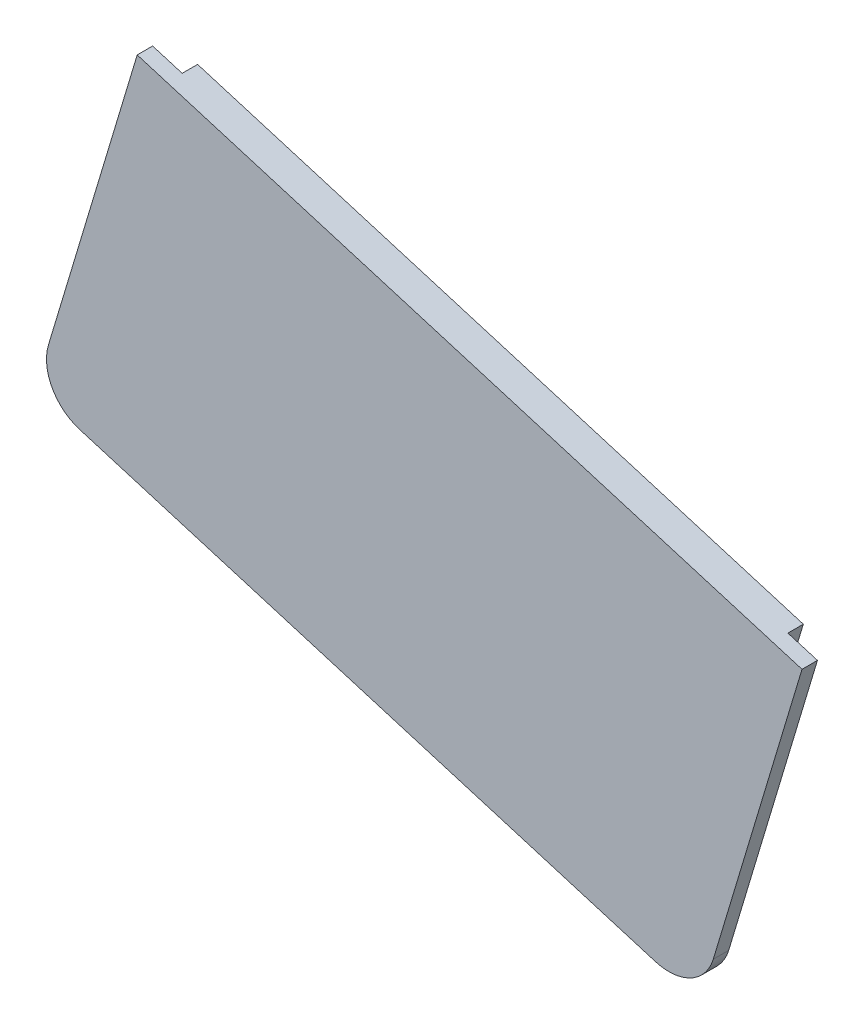
ISO-10303-21;
HEADER;
FILE_DESCRIPTION(('STEP AP214'),'2;1');
FILE_NAME('part.step','',(''),(''),'','','');
FILE_SCHEMA(('AUTOMOTIVE_DESIGN { 1 0 10303 214 1 1 1 1 }'));
ENDSEC;
DATA;
#1=APPLICATION_CONTEXT('core data for automotive mechanical design processes');
#2=APPLICATION_PROTOCOL_DEFINITION('international standard','automotive_design',2000,#1);
#3=PRODUCT_CONTEXT('',#1,'mechanical');
#4=PRODUCT('Part','Part','',(#3));
#5=PRODUCT_RELATED_PRODUCT_CATEGORY('part','',(#4));
#6=PRODUCT_DEFINITION_FORMATION('','',#4);
#7=PRODUCT_DEFINITION_CONTEXT('part definition',#1,'design');
#8=PRODUCT_DEFINITION('design','',#6,#7);
#9=PRODUCT_DEFINITION_SHAPE('','',#8);
#10=(LENGTH_UNIT() NAMED_UNIT(*) SI_UNIT(.MILLI.,.METRE.));
#11=(NAMED_UNIT(*) PLANE_ANGLE_UNIT() SI_UNIT($,.RADIAN.));
#12=(NAMED_UNIT(*) SI_UNIT($,.STERADIAN.) SOLID_ANGLE_UNIT());
#13=UNCERTAINTY_MEASURE_WITH_UNIT(LENGTH_MEASURE(1.E-05),#10,'distance_accuracy_value','');
#14=(GEOMETRIC_REPRESENTATION_CONTEXT(3) GLOBAL_UNCERTAINTY_ASSIGNED_CONTEXT((#13)) GLOBAL_UNIT_ASSIGNED_CONTEXT((#10,
#11,#12)) REPRESENTATION_CONTEXT('',''));
#15=CARTESIAN_POINT('',(0.,0.,0.));
#16=DIRECTION('',(0.,0.,1.));
#17=DIRECTION('',(1.,0.,0.));
#18=AXIS2_PLACEMENT_3D('',#15,#16,#17);
#19=CARTESIAN_POINT('',(263.324745566326,876.744268219338,-0.999999999999112));
#20=DIRECTION('',(-0.28764999389073,-0.95773560078691,0.));
#21=DIRECTION('',(0.95773560078691,-0.28764999389073,0.));
#22=AXIS2_PLACEMENT_3D('',#19,#20,#21);
#23=PLANE('',#22);
#24=DIRECTION('',(0.95773560078691,-0.28764999389073,0.));
#25=VECTOR('',#24,1.);
#26=CARTESIAN_POINT('',(263.324745566326,876.744268219338,8.88178419700125E-13));
#27=LINE('',#26,#25);
#28=CARTESIAN_POINT('',(3384.19815691943,-60.5908553490701,9.64506252643105E-13));
#29=VERTEX_POINT('',#28);
#30=CARTESIAN_POINT('',(3421.54984535012,-71.8092051108088,0.));
#31=VERTEX_POINT('',#30);
#32=EDGE_CURVE('E157',#29,#31,#27,.T.);
#33=ORIENTED_EDGE('',*,*,#32,.F.);
#34=DIRECTION('',(0.,0.,1.));
#35=VECTOR('',#34,1.);
#36=CARTESIAN_POINT('',(3384.19815691943,-60.5908553490701,-0.999999999999036));
#37=LINE('',#36,#35);
#38=CARTESIAN_POINT('',(3384.19815691943,-60.5908553490701,-0.999999999999036));
#39=VERTEX_POINT('',#38);
#40=EDGE_CURVE('E55',#39,#29,#37,.T.);
#41=ORIENTED_EDGE('',*,*,#40,.F.);
#42=DIRECTION('',(0.95773560078691,-0.28764999389073,0.));
#43=VECTOR('',#42,1.);
#44=CARTESIAN_POINT('',(263.324745566326,876.744268219338,-0.999999999999112));
#45=LINE('',#44,#43);
#46=CARTESIAN_POINT('',(3421.54984535012,-71.8092051108088,-1.00000000000002));
#47=VERTEX_POINT('',#46);
#48=EDGE_CURVE('E152',#39,#47,#45,.T.);
#49=ORIENTED_EDGE('',*,*,#48,.T.);
#50=DIRECTION('',(0.,0.,1.));
#51=VECTOR('',#50,1.);
#52=CARTESIAN_POINT('',(3421.54984535012,-71.8092051108088,-1.00000000000002));
#53=LINE('',#52,#51);
#54=EDGE_CURVE('E78',#47,#31,#53,.T.);
#55=ORIENTED_EDGE('',*,*,#54,.T.);
#56=EDGE_LOOP('',(#33,#41,#49,#55));
#57=FACE_BOUND('',#56,.T.);
#58=ADVANCED_FACE('F32',(#57),#23,.T.);
#59=CARTESIAN_POINT('',(3384.48580691332,-59.6331197482835,-0.999999999999972));
#60=DIRECTION('',(0.,0.,1.));
#61=DIRECTION('',(1.,0.,0.));
#62=AXIS2_PLACEMENT_3D('',#59,#60,#61);
#63=CYLINDRICAL_SURFACE('',#62,0.999999999999847);
#64=CARTESIAN_POINT('',(3384.48580691332,-59.6331197482835,0.));
#65=DIRECTION('',(0.,0.,1.));
#66=DIRECTION('',(1.,0.,0.));
#67=AXIS2_PLACEMENT_3D('',#64,#65,#66);
#68=CIRCLE('',#67,0.999999999999847);
#69=CARTESIAN_POINT('',(3383.52807131253,-59.3454697543922,0.));
#70=VERTEX_POINT('',#69);
#71=EDGE_CURVE('E168',#70,#29,#68,.T.);
#72=ORIENTED_EDGE('',*,*,#71,.F.);
#73=DIRECTION('',(0.,0.,1.));
#74=VECTOR('',#73,1.);
#75=CARTESIAN_POINT('',(3383.52807131253,-59.3454697543922,-1.00000000000006));
#76=LINE('',#75,#74);
#77=CARTESIAN_POINT('',(3383.52807131253,-59.3454697543922,-1.00000000000006));
#78=VERTEX_POINT('',#77);
#79=EDGE_CURVE('E172',#78,#70,#76,.T.);
#80=ORIENTED_EDGE('',*,*,#79,.F.);
#81=CARTESIAN_POINT('',(3384.48580691332,-59.6331197482835,-0.999999999999972));
#82=DIRECTION('',(0.,0.,1.));
#83=DIRECTION('',(1.,0.,0.));
#84=AXIS2_PLACEMENT_3D('',#81,#82,#83);
#85=CIRCLE('',#84,0.999999999999847);
#86=EDGE_CURVE('E150',#78,#39,#85,.T.);
#87=ORIENTED_EDGE('',*,*,#86,.T.);
#88=ORIENTED_EDGE('',*,*,#40,.T.);
#89=EDGE_LOOP('',(#72,#80,#87,#88));
#90=FACE_BOUND('',#89,.T.);
#91=ADVANCED_FACE('F181',(#90),#63,.T.);
#92=CARTESIAN_POINT('',(3119.91567575225,-937.047473574614,-0.99999999999914));
#93=DIRECTION('',(-0.9577356007869,0.287649993890763,0.));
#94=DIRECTION('',(-0.287649993890763,-0.9577356007869,0.));
#95=AXIS2_PLACEMENT_3D('',#92,#93,#94);
#96=PLANE('',#95);
#97=DIRECTION('',(0.,0.,1.));
#98=VECTOR('',#97,1.);
#99=CARTESIAN_POINT('',(3389.28107119035,-40.1907577386551,-0.999999999999269));
#100=LINE('',#99,#98);
#101=CARTESIAN_POINT('',(3389.28107119035,-40.190757738655,-1.0000000000015));
#102=VERTEX_POINT('',#101);
#103=CARTESIAN_POINT('',(3389.28107119035,-40.1907577386554,-2.70166159380493E-13));
#104=VERTEX_POINT('',#103);
#105=EDGE_CURVE('E208',#102,#104,#100,.T.);
#106=ORIENTED_EDGE('',*,*,#105,.F.);
#107=DIRECTION('',(-0.287649993890763,-0.957735600786899,0.));
#108=VECTOR('',#107,1.);
#109=CARTESIAN_POINT('',(3119.91567575225,-937.047473574614,-0.99999999999914));
#110=LINE('',#109,#108);
#111=EDGE_CURVE('E143',#102,#78,#110,.T.);
#112=ORIENTED_EDGE('',*,*,#111,.T.);
#113=ORIENTED_EDGE('',*,*,#79,.T.);
#114=DIRECTION('',(-0.287649993890763,-0.957735600786899,0.));
#115=VECTOR('',#114,1.);
#116=CARTESIAN_POINT('',(3119.91567575225,-937.047473574614,8.60422844084496E-13));
#117=LINE('',#116,#115);
#118=EDGE_CURVE('E166',#104,#70,#117,.T.);
#119=ORIENTED_EDGE('',*,*,#118,.F.);
#120=EDGE_LOOP('',(#106,#112,#113,#119));
#121=FACE_BOUND('',#120,.T.);
#122=ADVANCED_FACE('F249',(#121),#96,.T.);
#123=CARTESIAN_POINT('',(3159.18283538451,-948.84112332414,-0.999999999998224));
#124=DIRECTION('',(0.9577356007869,-0.287649993890764,0.));
#125=DIRECTION('',(0.287649993890764,0.9577356007869,0.));
#126=AXIS2_PLACEMENT_3D('',#123,#124,#125);
#127=PLANE('',#126);
#128=DIRECTION('',(0.,0.,-1.));
#129=VECTOR('',#128,1.);
#130=CARTESIAN_POINT('',(3428.54823082261,-51.984407488175,-0.999999999998353));
#131=LINE('',#130,#129);
#132=CARTESIAN_POINT('',(3428.54823082261,-51.9844074881753,2.44122021660709E-13));
#133=VERTEX_POINT('',#132);
#134=CARTESIAN_POINT('',(3428.54823082261,-51.9844074881751,-1.00000000000152));
#135=VERTEX_POINT('',#134);
#136=EDGE_CURVE('E127',#133,#135,#131,.T.);
#137=ORIENTED_EDGE('',*,*,#136,.F.);
#138=DIRECTION('',(0.287649993890764,0.957735600786899,0.));
#139=VECTOR('',#138,1.);
#140=CARTESIAN_POINT('',(3159.18283538451,-948.84112332414,1.77635683940025E-12));
#141=LINE('',#140,#139);
#142=CARTESIAN_POINT('',(3422.79523094479,-71.1391195039124,-1.51917269674006E-12));
#143=VERTEX_POINT('',#142);
#144=EDGE_CURVE('E164',#143,#133,#141,.T.);
#145=ORIENTED_EDGE('',*,*,#144,.F.);
#146=DIRECTION('',(0.,0.,1.));
#147=VECTOR('',#146,1.);
#148=CARTESIAN_POINT('',(3422.7952309448,-71.1391195039127,-0.999999999999126));
#149=LINE('',#148,#147);
#150=CARTESIAN_POINT('',(3422.7952309448,-71.1391195039127,-0.999999999999126));
#151=VERTEX_POINT('',#150);
#152=EDGE_CURVE('E147',#151,#143,#149,.T.);
#153=ORIENTED_EDGE('',*,*,#152,.F.);
#154=DIRECTION('',(0.287649993890764,0.957735600786899,0.));
#155=VECTOR('',#154,1.);
#156=CARTESIAN_POINT('',(3159.18283538451,-948.84112332414,-0.999999999998224));
#157=LINE('',#156,#155);
#158=EDGE_CURVE('E141',#151,#135,#157,.T.);
#159=ORIENTED_EDGE('',*,*,#158,.T.);
#160=EDGE_LOOP('',(#137,#145,#153,#159));
#161=FACE_BOUND('',#160,.T.);
#162=ADVANCED_FACE('F145',(#161),#127,.T.);
#163=CARTESIAN_POINT('',(3421.83749534401,-70.8514695100219,-0.999999999999951));
#164=DIRECTION('',(0.,0.,1.));
#165=DIRECTION('',(1.,0.,0.));
#166=AXIS2_PLACEMENT_3D('',#163,#164,#165);
#167=CYLINDRICAL_SURFACE('',#166,0.999999999999801);
#168=CARTESIAN_POINT('',(3421.83749534401,-70.8514695100219,0.));
#169=DIRECTION('',(0.,0.,1.));
#170=DIRECTION('',(1.,0.,0.));
#171=AXIS2_PLACEMENT_3D('',#168,#169,#170);
#172=CIRCLE('',#171,0.999999999999801);
#173=EDGE_CURVE('E160',#31,#143,#172,.T.);
#174=ORIENTED_EDGE('',*,*,#173,.F.);
#175=ORIENTED_EDGE('',*,*,#54,.F.);
#176=CARTESIAN_POINT('',(3421.83749534401,-70.8514695100219,-0.999999999999951));
#177=DIRECTION('',(0.,0.,1.));
#178=DIRECTION('',(1.,0.,0.));
#179=AXIS2_PLACEMENT_3D('',#176,#177,#178);
#180=CIRCLE('',#179,0.999999999999801);
#181=EDGE_CURVE('E148',#47,#151,#180,.T.);
#182=ORIENTED_EDGE('',*,*,#181,.T.);
#183=ORIENTED_EDGE('',*,*,#152,.T.);
#184=EDGE_LOOP('',(#174,#175,#182,#183));
#185=FACE_BOUND('',#184,.T.);
#186=ADVANCED_FACE('F175',(#185),#167,.T.);
#187=CARTESIAN_POINT('',(0.,0.,-1.));
#188=DIRECTION('',(0.,0.,1.));
#189=DIRECTION('',(1.,0.,0.));
#190=AXIS2_PLACEMENT_3D('',#187,#188,#189);
#191=PLANE('',#190);
#192=ORIENTED_EDGE('',*,*,#111,.F.);
#193=DIRECTION('',(-0.957735600786908,0.287649993890735,0.));
#194=VECTOR('',#193,1.);
#195=CARTESIAN_POINT('',(3448.79407593957,-58.0651224782227,-1.00000000000153));
#196=LINE('',#195,#194);
#197=EDGE_CURVE('E130',#135,#102,#196,.T.);
#198=ORIENTED_EDGE('',*,*,#197,.F.);
#199=ORIENTED_EDGE('',*,*,#158,.F.);
#200=ORIENTED_EDGE('',*,*,#181,.F.);
#201=ORIENTED_EDGE('',*,*,#48,.F.);
#202=ORIENTED_EDGE('',*,*,#86,.F.);
#203=EDGE_LOOP('',(#192,#198,#199,#200,#201,#202));
#204=FACE_BOUND('',#203,.T.);
#205=ADVANCED_FACE('F140',(#204),#191,.F.);
#206=CARTESIAN_POINT('',(3161.09830658609,-949.416423311924,1.00000000000025));
#207=DIRECTION('',(-0.957735600786899,0.287649993890765,0.));
#208=DIRECTION('',(-0.287649993890765,-0.957735600786899,0.));
#209=AXIS2_PLACEMENT_3D('',#206,#207,#208);
#210=PLANE('',#209);
#211=DIRECTION('',(0.287649993890765,0.957735600786899,0.));
#212=VECTOR('',#211,1.);
#213=CARTESIAN_POINT('',(3161.09830658609,-949.416423311924,2.4980018054066E-13));
#214=LINE('',#213,#212);
#215=CARTESIAN_POINT('',(3424.71070214637,-71.7144194916946,0.));
#216=VERTEX_POINT('',#215);
#217=CARTESIAN_POINT('',(3430.46370202418,-52.5597074759562,-6.36539362356855E-13));
#218=VERTEX_POINT('',#217);
#219=EDGE_CURVE('E205',#216,#218,#214,.T.);
#220=ORIENTED_EDGE('',*,*,#219,.T.);
#221=DIRECTION('',(0.,0.,1.));
#222=VECTOR('',#221,1.);
#223=CARTESIAN_POINT('',(3430.46370202418,-52.5597074759563,1.00000000000012));
#224=LINE('',#223,#222);
#225=CARTESIAN_POINT('',(3430.46370202418,-52.5597074759563,1.00000000000007));
#226=VERTEX_POINT('',#225);
#227=EDGE_CURVE('E46',#218,#226,#224,.T.);
#228=ORIENTED_EDGE('',*,*,#227,.T.);
#229=DIRECTION('',(0.287649993890765,0.957735600786899,0.));
#230=VECTOR('',#229,1.);
#231=CARTESIAN_POINT('',(3161.09830658609,-949.416423311924,1.00000000000025));
#232=LINE('',#231,#230);
#233=CARTESIAN_POINT('',(3424.71070214637,-71.7144194916946,1.00000000000001));
#234=VERTEX_POINT('',#233);
#235=EDGE_CURVE('E198',#234,#226,#232,.T.);
#236=ORIENTED_EDGE('',*,*,#235,.F.);
#237=DIRECTION('',(0.,0.,-1.));
#238=VECTOR('',#237,1.);
#239=CARTESIAN_POINT('',(3424.71070214637,-71.7144194916946,1.00000000000001));
#240=LINE('',#239,#238);
#241=EDGE_CURVE('E192',#234,#216,#240,.T.);
#242=ORIENTED_EDGE('',*,*,#241,.T.);
#243=EDGE_LOOP('',(#220,#228,#236,#242));
#244=FACE_BOUND('',#243,.T.);
#245=ADVANCED_FACE('F225',(#244),#210,.F.);
#246=CARTESIAN_POINT('',(3118.00020455072,-936.472173586769,1.00000000000124));
#247=DIRECTION('',(0.957735600786906,-0.287649993890742,0.));
#248=DIRECTION('',(0.287649993890742,0.957735600786906,0.));
#249=AXIS2_PLACEMENT_3D('',#246,#247,#248);
#250=PLANE('',#249);
#251=DIRECTION('',(-0.287649993890742,-0.957735600786906,0.));
#252=VECTOR('',#251,1.);
#253=CARTESIAN_POINT('',(3118.00020455072,-936.472173586769,1.00000000000124));
#254=LINE('',#253,#252);
#255=CARTESIAN_POINT('',(3387.36559998877,-39.6154577508733,0.999999999999892));
#256=VERTEX_POINT('',#255);
#257=CARTESIAN_POINT('',(3381.61260011096,-58.770169766611,1.00000000000015));
#258=VERTEX_POINT('',#257);
#259=EDGE_CURVE('E214',#256,#258,#254,.T.);
#260=ORIENTED_EDGE('',*,*,#259,.F.);
#261=DIRECTION('',(0.,0.,-1.));
#262=VECTOR('',#261,1.);
#263=CARTESIAN_POINT('',(3387.36559998877,-39.615457750873,1.00000000000111));
#264=LINE('',#263,#262);
#265=CARTESIAN_POINT('',(3387.36559998877,-39.615457750873,0.));
#266=VERTEX_POINT('',#265);
#267=EDGE_CURVE('E219',#256,#266,#264,.T.);
#268=ORIENTED_EDGE('',*,*,#267,.T.);
#269=DIRECTION('',(-0.287649993890742,-0.957735600786906,0.));
#270=VECTOR('',#269,1.);
#271=CARTESIAN_POINT('',(3118.00020455072,-936.472173586769,1.23512311489549E-12));
#272=LINE('',#271,#270);
#273=CARTESIAN_POINT('',(3381.61260011096,-58.770169766611,1.45716771982052E-13));
#274=VERTEX_POINT('',#273);
#275=EDGE_CURVE('E203',#266,#274,#272,.T.);
#276=ORIENTED_EDGE('',*,*,#275,.T.);
#277=DIRECTION('',(0.,0.,-1.));
#278=VECTOR('',#277,1.);
#279=CARTESIAN_POINT('',(3381.61260011096,-58.770169766611,1.00000000000015));
#280=LINE('',#279,#278);
#281=EDGE_CURVE('E161',#258,#274,#280,.T.);
#282=ORIENTED_EDGE('',*,*,#281,.F.);
#283=EDGE_LOOP('',(#260,#268,#276,#282));
#284=FACE_BOUND('',#283,.T.);
#285=ADVANCED_FACE('F248',(#284),#250,.F.);
#286=CARTESIAN_POINT('',(3384.48580691332,-59.6331197482835,1.00000000000003));
#287=DIRECTION('',(0.,0.,-1.));
#288=DIRECTION('',(-1.,0.,0.));
#289=AXIS2_PLACEMENT_3D('',#286,#287,#288);
#290=CYLINDRICAL_SURFACE('',#289,3.00000000000002);
#291=CARTESIAN_POINT('',(3384.48580691332,-59.6331197482835,0.));
#292=DIRECTION('',(0.,0.,1.));
#293=DIRECTION('',(1.,0.,0.));
#294=AXIS2_PLACEMENT_3D('',#291,#292,#293);
#295=CIRCLE('',#294,3.00000000000002);
#296=CARTESIAN_POINT('',(3383.62285693165,-62.5063265506436,7.49400541621981E-13));
#297=VERTEX_POINT('',#296);
#298=EDGE_CURVE('E201',#274,#297,#295,.T.);
#299=ORIENTED_EDGE('',*,*,#298,.T.);
#300=DIRECTION('',(0.,0.,-1.));
#301=VECTOR('',#300,1.);
#302=CARTESIAN_POINT('',(3383.62285693165,-62.5063265506436,1.00000000000075));
#303=LINE('',#302,#301);
#304=CARTESIAN_POINT('',(3383.62285693165,-62.5063265506436,1.00000000000075));
#305=VERTEX_POINT('',#304);
#306=EDGE_CURVE('E186',#305,#297,#303,.T.);
#307=ORIENTED_EDGE('',*,*,#306,.F.);
#308=CARTESIAN_POINT('',(3384.48580691332,-59.6331197482835,1.00000000000003));
#309=DIRECTION('',(0.,0.,1.));
#310=DIRECTION('',(1.,0.,0.));
#311=AXIS2_PLACEMENT_3D('',#308,#309,#310);
#312=CIRCLE('',#311,3.00000000000002);
#313=EDGE_CURVE('E212',#258,#305,#312,.T.);
#314=ORIENTED_EDGE('',*,*,#313,.F.);
#315=ORIENTED_EDGE('',*,*,#281,.T.);
#316=EDGE_LOOP('',(#299,#307,#314,#315));
#317=FACE_BOUND('',#316,.T.);
#318=ADVANCED_FACE('F245',(#317),#290,.T.);
#319=CARTESIAN_POINT('',(262.749445578553,874.828797017778,1.));
#320=DIRECTION('',(0.287649993890735,0.957735600786908,0.));
#321=DIRECTION('',(-0.957735600786908,0.287649993890735,0.));
#322=AXIS2_PLACEMENT_3D('',#319,#320,#321);
#323=PLANE('',#322);
#324=DIRECTION('',(0.957735600786909,-0.287649993890735,0.));
#325=VECTOR('',#324,1.);
#326=CARTESIAN_POINT('',(262.749445578553,874.828797017778,0.));
#327=LINE('',#326,#325);
#328=CARTESIAN_POINT('',(3420.97454536234,-73.7246763123831,0.));
#329=VERTEX_POINT('',#328);
#330=EDGE_CURVE('E199',#297,#329,#327,.T.);
#331=ORIENTED_EDGE('',*,*,#330,.T.);
#332=DIRECTION('',(0.,0.,-1.));
#333=VECTOR('',#332,1.);
#334=CARTESIAN_POINT('',(3420.97454536234,-73.7246763123831,1.00000000000003));
#335=LINE('',#334,#333);
#336=CARTESIAN_POINT('',(3420.97454536234,-73.7246763123831,1.00000000000003));
#337=VERTEX_POINT('',#336);
#338=EDGE_CURVE('E189',#337,#329,#335,.T.);
#339=ORIENTED_EDGE('',*,*,#338,.F.);
#340=DIRECTION('',(0.957735600786909,-0.287649993890735,0.));
#341=VECTOR('',#340,1.);
#342=CARTESIAN_POINT('',(262.749445578553,874.828797017778,1.));
#343=LINE('',#342,#341);
#344=EDGE_CURVE('E210',#305,#337,#343,.T.);
#345=ORIENTED_EDGE('',*,*,#344,.F.);
#346=ORIENTED_EDGE('',*,*,#306,.T.);
#347=EDGE_LOOP('',(#331,#339,#345,#346));
#348=FACE_BOUND('',#347,.T.);
#349=ADVANCED_FACE('F241',(#348),#323,.F.);
#350=CARTESIAN_POINT('',(3421.83749534401,-70.8514695100219,1.00000000000005));
#351=DIRECTION('',(0.,0.,-1.));
#352=DIRECTION('',(-1.,0.,0.));
#353=AXIS2_PLACEMENT_3D('',#350,#351,#352);
#354=CYLINDRICAL_SURFACE('',#353,2.9999999999999);
#355=CARTESIAN_POINT('',(3421.83749534401,-70.8514695100219,0.));
#356=DIRECTION('',(0.,0.,1.));
#357=DIRECTION('',(1.,0.,0.));
#358=AXIS2_PLACEMENT_3D('',#355,#356,#357);
#359=CIRCLE('',#358,2.9999999999999);
#360=EDGE_CURVE('E196',#329,#216,#359,.T.);
#361=ORIENTED_EDGE('',*,*,#360,.T.);
#362=ORIENTED_EDGE('',*,*,#241,.F.);
#363=CARTESIAN_POINT('',(3421.83749534401,-70.8514695100219,1.00000000000005));
#364=DIRECTION('',(0.,0.,1.));
#365=DIRECTION('',(1.,0.,0.));
#366=AXIS2_PLACEMENT_3D('',#363,#364,#365);
#367=CIRCLE('',#366,2.9999999999999);
#368=EDGE_CURVE('E195',#337,#234,#367,.T.);
#369=ORIENTED_EDGE('',*,*,#368,.F.);
#370=ORIENTED_EDGE('',*,*,#338,.T.);
#371=EDGE_LOOP('',(#361,#362,#369,#370));
#372=FACE_BOUND('',#371,.T.);
#373=ADVANCED_FACE('F236',(#372),#354,.T.);
#374=CARTESIAN_POINT('',(0.,0.,1.));
#375=DIRECTION('',(0.,0.,1.));
#376=DIRECTION('',(1.,0.,0.));
#377=AXIS2_PLACEMENT_3D('',#374,#375,#376);
#378=PLANE('',#377);
#379=DIRECTION('',(0.957735600786908,-0.287649993890736,0.));
#380=VECTOR('',#379,1.);
#381=CARTESIAN_POINT('',(269.365395438042,896.856715835879,0.999999999999871));
#382=LINE('',#381,#380);
#383=EDGE_CURVE('E135',#256,#226,#382,.T.);
#384=ORIENTED_EDGE('',*,*,#383,.F.);
#385=ORIENTED_EDGE('',*,*,#259,.T.);
#386=ORIENTED_EDGE('',*,*,#313,.T.);
#387=ORIENTED_EDGE('',*,*,#344,.T.);
#388=ORIENTED_EDGE('',*,*,#368,.T.);
#389=ORIENTED_EDGE('',*,*,#235,.T.);
#390=EDGE_LOOP('',(#384,#385,#386,#387,#388,#389));
#391=FACE_BOUND('',#390,.T.);
#392=ADVANCED_FACE('F229',(#391),#378,.T.);
#393=CARTESIAN_POINT('',(0.,0.,0.));
#394=DIRECTION('',(0.,0.,1.));
#395=DIRECTION('',(1.,0.,0.));
#396=AXIS2_PLACEMENT_3D('',#393,#394,#395);
#397=PLANE('',#396);
#398=ORIENTED_EDGE('',*,*,#275,.F.);
#399=DIRECTION('',(0.957735600786908,-0.287649993890736,0.));
#400=VECTOR('',#399,1.);
#401=CARTESIAN_POINT('',(269.365395438042,896.856715835879,-1.29058588513454E-13));
#402=LINE('',#401,#400);
#403=EDGE_CURVE('E11',#266,#104,#402,.T.);
#404=ORIENTED_EDGE('',*,*,#403,.T.);
#405=ORIENTED_EDGE('',*,*,#118,.T.);
#406=ORIENTED_EDGE('',*,*,#71,.T.);
#407=ORIENTED_EDGE('',*,*,#32,.T.);
#408=ORIENTED_EDGE('',*,*,#173,.T.);
#409=ORIENTED_EDGE('',*,*,#144,.T.);
#410=EDGE_CURVE('E35',#133,#218,#402,.T.);
#411=ORIENTED_EDGE('',*,*,#410,.T.);
#412=ORIENTED_EDGE('',*,*,#219,.F.);
#413=ORIENTED_EDGE('',*,*,#360,.F.);
#414=ORIENTED_EDGE('',*,*,#330,.F.);
#415=ORIENTED_EDGE('',*,*,#298,.F.);
#416=EDGE_LOOP('',(#398,#404,#405,#406,#407,#408,#409,#411,#412,#413,#414,#415));
#417=FACE_BOUND('',#416,.T.);
#418=ADVANCED_FACE('F178',(#417),#397,.F.);
#419=CARTESIAN_POINT('',(3448.79407593957,-58.0651224782227,8.99999999999847));
#420=DIRECTION('',(-0.287649993890735,-0.957735600786908,0.));
#421=DIRECTION('',(0.957735600786908,-0.287649993890735,0.));
#422=AXIS2_PLACEMENT_3D('',#419,#420,#421);
#423=PLANE('',#422);
#424=ORIENTED_EDGE('',*,*,#105,.T.);
#425=ORIENTED_EDGE('',*,*,#403,.F.);
#426=ORIENTED_EDGE('',*,*,#267,.F.);
#427=ORIENTED_EDGE('',*,*,#383,.T.);
#428=ORIENTED_EDGE('',*,*,#227,.F.);
#429=ORIENTED_EDGE('',*,*,#410,.F.);
#430=ORIENTED_EDGE('',*,*,#136,.T.);
#431=ORIENTED_EDGE('',*,*,#197,.T.);
#432=EDGE_LOOP('',(#424,#425,#426,#427,#428,#429,#430,#431));
#433=FACE_BOUND('',#432,.T.);
#434=ADVANCED_FACE('F129',(#433),#423,.F.);
#435=CLOSED_SHELL('',(#58,#91,#122,#162,#186,#205,#245,#285,#318,#349,#373,#392,#418,#434));
#436=MANIFOLD_SOLID_BREP('B2',#435);
#437=ADVANCED_BREP_SHAPE_REPRESENTATION('',(#18,#436),#14);
#438=SHAPE_DEFINITION_REPRESENTATION(#9,#437);
ENDSEC;
END-ISO-10303-21;
